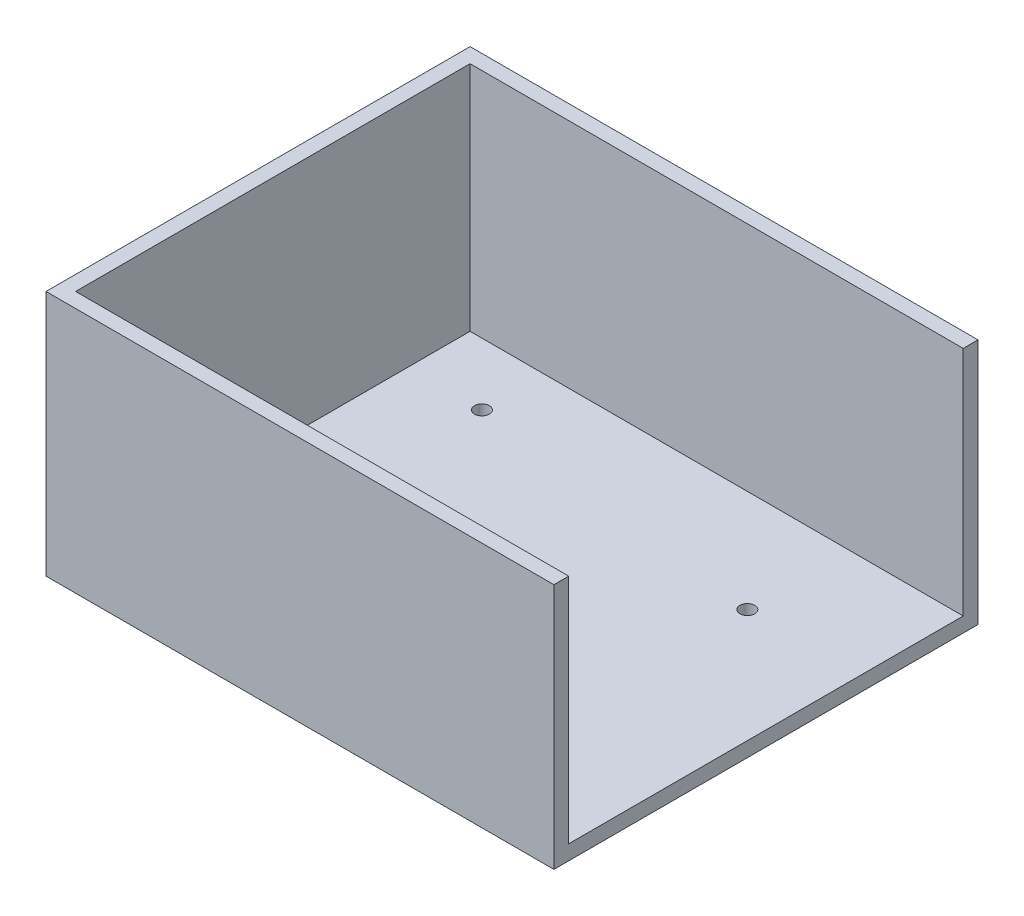
ISO-10303-21;
HEADER;
FILE_DESCRIPTION(('STEP AP214'),'2;1');
FILE_NAME('part.step','',(''),(''),'','','');
FILE_SCHEMA(('AUTOMOTIVE_DESIGN { 1 0 10303 214 1 1 1 1 }'));
ENDSEC;
DATA;
#1=APPLICATION_CONTEXT('core data for automotive mechanical design processes');
#2=APPLICATION_PROTOCOL_DEFINITION('international standard','automotive_design',2000,#1);
#3=PRODUCT_CONTEXT('',#1,'mechanical');
#4=PRODUCT('Part','Part','',(#3));
#5=PRODUCT_RELATED_PRODUCT_CATEGORY('part','',(#4));
#6=PRODUCT_DEFINITION_FORMATION('','',#4);
#7=PRODUCT_DEFINITION_CONTEXT('part definition',#1,'design');
#8=PRODUCT_DEFINITION('design','',#6,#7);
#9=PRODUCT_DEFINITION_SHAPE('','',#8);
#10=(LENGTH_UNIT() NAMED_UNIT(*) SI_UNIT(.MILLI.,.METRE.));
#11=(NAMED_UNIT(*) PLANE_ANGLE_UNIT() SI_UNIT($,.RADIAN.));
#12=(NAMED_UNIT(*) SI_UNIT($,.STERADIAN.) SOLID_ANGLE_UNIT());
#13=UNCERTAINTY_MEASURE_WITH_UNIT(LENGTH_MEASURE(1.E-05),#10,'distance_accuracy_value','');
#14=(GEOMETRIC_REPRESENTATION_CONTEXT(3) GLOBAL_UNCERTAINTY_ASSIGNED_CONTEXT((#13)) GLOBAL_UNIT_ASSIGNED_CONTEXT((#10,
#11,#12)) REPRESENTATION_CONTEXT('',''));
#15=CARTESIAN_POINT('',(0.,0.,0.));
#16=DIRECTION('',(0.,0.,1.));
#17=DIRECTION('',(1.,0.,0.));
#18=AXIS2_PLACEMENT_3D('',#15,#16,#17);
#19=CARTESIAN_POINT('',(0.,3.,0.));
#20=DIRECTION('',(0.,-1.,0.));
#21=DIRECTION('',(0.,0.,-1.));
#22=AXIS2_PLACEMENT_3D('',#19,#20,#21);
#23=PLANE('',#22);
#24=DIRECTION('',(0.,0.,1.));
#25=VECTOR('',#24,1.);
#26=CARTESIAN_POINT('',(0.,3.,0.));
#27=LINE('',#26,#25);
#28=CARTESIAN_POINT('',(0.,3.,-80.));
#29=VERTEX_POINT('',#28);
#30=CARTESIAN_POINT('',(0.,3.,0.));
#31=VERTEX_POINT('',#30);
#32=EDGE_CURVE('E49',#29,#31,#27,.T.);
#33=ORIENTED_EDGE('',*,*,#32,.T.);
#34=DIRECTION('',(1.,0.,0.));
#35=VECTOR('',#34,1.);
#36=CARTESIAN_POINT('',(0.,3.,0.));
#37=LINE('',#36,#35);
#38=CARTESIAN_POINT('',(100.,3.,0.));
#39=VERTEX_POINT('',#38);
#40=EDGE_CURVE('E185',#31,#39,#37,.T.);
#41=ORIENTED_EDGE('',*,*,#40,.T.);
#42=DIRECTION('',(0.,0.,-1.));
#43=VECTOR('',#42,1.);
#44=CARTESIAN_POINT('',(100.,3.,0.));
#45=LINE('',#44,#43);
#46=CARTESIAN_POINT('',(100.,3.,-80.));
#47=VERTEX_POINT('',#46);
#48=EDGE_CURVE('E42',#39,#47,#45,.T.);
#49=ORIENTED_EDGE('',*,*,#48,.T.);
#50=DIRECTION('',(-1.,0.,0.));
#51=VECTOR('',#50,1.);
#52=CARTESIAN_POINT('',(0.,3.,-80.));
#53=LINE('',#52,#51);
#54=EDGE_CURVE('E11',#47,#29,#53,.T.);
#55=ORIENTED_EDGE('',*,*,#54,.T.);
#56=EDGE_LOOP('',(#33,#41,#49,#55));
#57=FACE_BOUND('',#56,.T.);
#58=CARTESIAN_POINT('',(15.,3.,-67.4));
#59=DIRECTION('',(0.,1.,0.));
#60=DIRECTION('',(0.,0.,1.));
#61=AXIS2_PLACEMENT_3D('',#58,#59,#60);
#62=CIRCLE('',#61,1.5);
#63=CARTESIAN_POINT('',(15.,3.,-65.9));
#64=VERTEX_POINT('',#63);
#65=EDGE_CURVE('E179',#64,#64,#62,.T.);
#66=ORIENTED_EDGE('',*,*,#65,.F.);
#67=EDGE_LOOP('',(#66));
#68=FACE_BOUND('',#67,.T.);
#69=CARTESIAN_POINT('',(15.,3.,-12.6));
#70=DIRECTION('',(0.,1.,0.));
#71=DIRECTION('',(0.,0.,-1.));
#72=AXIS2_PLACEMENT_3D('',#69,#70,#71);
#73=CIRCLE('',#72,1.5);
#74=CARTESIAN_POINT('',(15.,3.,-14.1));
#75=VERTEX_POINT('',#74);
#76=EDGE_CURVE('E173',#75,#75,#73,.T.);
#77=ORIENTED_EDGE('',*,*,#76,.F.);
#78=EDGE_LOOP('',(#77));
#79=FACE_BOUND('',#78,.T.);
#80=CARTESIAN_POINT('',(76.9789532049797,3.,-59.25));
#81=DIRECTION('',(0.,1.,0.));
#82=DIRECTION('',(0.,0.,1.));
#83=AXIS2_PLACEMENT_3D('',#80,#81,#82);
#84=CIRCLE('',#83,1.5);
#85=CARTESIAN_POINT('',(76.9789532049797,3.,-57.75));
#86=VERTEX_POINT('',#85);
#87=EDGE_CURVE('E167',#86,#86,#84,.T.);
#88=ORIENTED_EDGE('',*,*,#87,.F.);
#89=EDGE_LOOP('',(#88));
#90=FACE_BOUND('',#89,.T.);
#91=CARTESIAN_POINT('',(76.9789532049797,3.,-20.75));
#92=DIRECTION('',(0.,1.,0.));
#93=DIRECTION('',(0.,0.,-1.));
#94=AXIS2_PLACEMENT_3D('',#91,#92,#93);
#95=CIRCLE('',#94,1.5);
#96=CARTESIAN_POINT('',(76.9789532049797,3.,-22.25));
#97=VERTEX_POINT('',#96);
#98=EDGE_CURVE('E161',#97,#97,#95,.T.);
#99=ORIENTED_EDGE('',*,*,#98,.F.);
#100=EDGE_LOOP('',(#99));
#101=FACE_BOUND('',#100,.T.);
#102=ADVANCED_FACE('F33',(#57,#68,#79,#90,#101),#23,.F.);
#103=CARTESIAN_POINT('',(0.,0.,0.));
#104=DIRECTION('',(0.,-1.,0.));
#105=DIRECTION('',(0.,0.,-1.));
#106=AXIS2_PLACEMENT_3D('',#103,#104,#105);
#107=PLANE('',#106);
#108=CARTESIAN_POINT('',(76.9789532049797,0.,-59.25));
#109=DIRECTION('',(0.,1.,0.));
#110=DIRECTION('',(0.,0.,1.));
#111=AXIS2_PLACEMENT_3D('',#108,#109,#110);
#112=CIRCLE('',#111,1.5);
#113=CARTESIAN_POINT('',(76.9789532049797,0.,-57.75));
#114=VERTEX_POINT('',#113);
#115=EDGE_CURVE('E164',#114,#114,#112,.T.);
#116=ORIENTED_EDGE('',*,*,#115,.T.);
#117=EDGE_LOOP('',(#116));
#118=FACE_BOUND('',#117,.T.);
#119=CARTESIAN_POINT('',(15.,0.,-67.4));
#120=DIRECTION('',(0.,1.,0.));
#121=DIRECTION('',(0.,0.,1.));
#122=AXIS2_PLACEMENT_3D('',#119,#120,#121);
#123=CIRCLE('',#122,1.5);
#124=CARTESIAN_POINT('',(15.,0.,-65.9));
#125=VERTEX_POINT('',#124);
#126=EDGE_CURVE('E176',#125,#125,#123,.T.);
#127=ORIENTED_EDGE('',*,*,#126,.T.);
#128=EDGE_LOOP('',(#127));
#129=FACE_BOUND('',#128,.T.);
#130=DIRECTION('',(1.,0.,0.));
#131=VECTOR('',#130,1.);
#132=CARTESIAN_POINT('',(0.,0.,3.));
#133=LINE('',#132,#131);
#134=CARTESIAN_POINT('',(-3.,0.,3.));
#135=VERTEX_POINT('',#134);
#136=CARTESIAN_POINT('',(100.,0.,3.));
#137=VERTEX_POINT('',#136);
#138=EDGE_CURVE('E117',#135,#137,#133,.T.);
#139=ORIENTED_EDGE('',*,*,#138,.F.);
#140=DIRECTION('',(0.,0.,1.));
#141=VECTOR('',#140,1.);
#142=CARTESIAN_POINT('',(-3.,0.,-83.));
#143=LINE('',#142,#141);
#144=CARTESIAN_POINT('',(-3.,0.,-83.));
#145=VERTEX_POINT('',#144);
#146=EDGE_CURVE('E113',#145,#135,#143,.T.);
#147=ORIENTED_EDGE('',*,*,#146,.F.);
#148=DIRECTION('',(1.,0.,0.));
#149=VECTOR('',#148,1.);
#150=CARTESIAN_POINT('',(0.,0.,-83.));
#151=LINE('',#150,#149);
#152=CARTESIAN_POINT('',(100.,0.,-83.));
#153=VERTEX_POINT('',#152);
#154=EDGE_CURVE('E101',#145,#153,#151,.T.);
#155=ORIENTED_EDGE('',*,*,#154,.T.);
#156=DIRECTION('',(0.,0.,-1.));
#157=VECTOR('',#156,1.);
#158=CARTESIAN_POINT('',(100.,0.,0.));
#159=LINE('',#158,#157);
#160=EDGE_CURVE('E37',#137,#153,#159,.T.);
#161=ORIENTED_EDGE('',*,*,#160,.F.);
#162=EDGE_LOOP('',(#139,#147,#155,#161));
#163=FACE_BOUND('',#162,.T.);
#164=CARTESIAN_POINT('',(15.,0.,-12.6));
#165=DIRECTION('',(0.,1.,0.));
#166=DIRECTION('',(0.,0.,-1.));
#167=AXIS2_PLACEMENT_3D('',#164,#165,#166);
#168=CIRCLE('',#167,1.5);
#169=CARTESIAN_POINT('',(15.,0.,-14.1));
#170=VERTEX_POINT('',#169);
#171=EDGE_CURVE('E170',#170,#170,#168,.T.);
#172=ORIENTED_EDGE('',*,*,#171,.T.);
#173=EDGE_LOOP('',(#172));
#174=FACE_BOUND('',#173,.T.);
#175=CARTESIAN_POINT('',(76.9789532049797,0.,-20.75));
#176=DIRECTION('',(0.,1.,0.));
#177=DIRECTION('',(0.,0.,-1.));
#178=AXIS2_PLACEMENT_3D('',#175,#176,#177);
#179=CIRCLE('',#178,1.5);
#180=CARTESIAN_POINT('',(76.9789532049797,0.,-22.25));
#181=VERTEX_POINT('',#180);
#182=EDGE_CURVE('E160',#181,#181,#179,.T.);
#183=ORIENTED_EDGE('',*,*,#182,.T.);
#184=EDGE_LOOP('',(#183));
#185=FACE_BOUND('',#184,.T.);
#186=ADVANCED_FACE('F114',(#118,#129,#163,#174,#185),#107,.T.);
#187=CARTESIAN_POINT('',(100.,3.,0.));
#188=DIRECTION('',(-1.,0.,0.));
#189=DIRECTION('',(0.,0.,1.));
#190=AXIS2_PLACEMENT_3D('',#187,#188,#189);
#191=PLANE('',#190);
#192=ORIENTED_EDGE('',*,*,#160,.T.);
#193=DIRECTION('',(0.,1.,0.));
#194=VECTOR('',#193,1.);
#195=CARTESIAN_POINT('',(100.,0.,-83.));
#196=LINE('',#195,#194);
#197=CARTESIAN_POINT('',(100.,50.,-83.));
#198=VERTEX_POINT('',#197);
#199=EDGE_CURVE('E108',#153,#198,#196,.T.);
#200=ORIENTED_EDGE('',*,*,#199,.T.);
#201=DIRECTION('',(0.,0.,1.));
#202=VECTOR('',#201,1.);
#203=CARTESIAN_POINT('',(100.,50.,-83.));
#204=LINE('',#203,#202);
#205=CARTESIAN_POINT('',(100.,50.,-80.));
#206=VERTEX_POINT('',#205);
#207=EDGE_CURVE('E110',#198,#206,#204,.T.);
#208=ORIENTED_EDGE('',*,*,#207,.T.);
#209=DIRECTION('',(0.,1.,0.));
#210=VECTOR('',#209,1.);
#211=CARTESIAN_POINT('',(100.,0.,-80.));
#212=LINE('',#211,#210);
#213=EDGE_CURVE('E137',#47,#206,#212,.T.);
#214=ORIENTED_EDGE('',*,*,#213,.F.);
#215=ORIENTED_EDGE('',*,*,#48,.F.);
#216=DIRECTION('',(0.,1.,0.));
#217=VECTOR('',#216,1.);
#218=CARTESIAN_POINT('',(100.,0.,0.));
#219=LINE('',#218,#217);
#220=CARTESIAN_POINT('',(100.,50.,0.));
#221=VERTEX_POINT('',#220);
#222=EDGE_CURVE('E57',#39,#221,#219,.T.);
#223=ORIENTED_EDGE('',*,*,#222,.T.);
#224=DIRECTION('',(0.,0.,-1.));
#225=VECTOR('',#224,1.);
#226=CARTESIAN_POINT('',(100.,50.,3.));
#227=LINE('',#226,#225);
#228=CARTESIAN_POINT('',(100.,50.,3.));
#229=VERTEX_POINT('',#228);
#230=EDGE_CURVE('E153',#229,#221,#227,.T.);
#231=ORIENTED_EDGE('',*,*,#230,.F.);
#232=DIRECTION('',(0.,1.,0.));
#233=VECTOR('',#232,1.);
#234=CARTESIAN_POINT('',(100.,0.,3.));
#235=LINE('',#234,#233);
#236=EDGE_CURVE('E148',#137,#229,#235,.T.);
#237=ORIENTED_EDGE('',*,*,#236,.F.);
#238=EDGE_LOOP('',(#192,#200,#208,#214,#215,#223,#231,#237));
#239=FACE_BOUND('',#238,.T.);
#240=ADVANCED_FACE('F35',(#239),#191,.F.);
#241=CARTESIAN_POINT('',(15.,3.,-67.4));
#242=DIRECTION('',(0.,-1.,0.));
#243=DIRECTION('',(0.,0.,-1.));
#244=AXIS2_PLACEMENT_3D('',#241,#242,#243);
#245=CYLINDRICAL_SURFACE('',#244,1.5);
#246=ORIENTED_EDGE('',*,*,#65,.T.);
#247=EDGE_LOOP('',(#246));
#248=FACE_BOUND('',#247,.T.);
#249=ORIENTED_EDGE('',*,*,#126,.F.);
#250=EDGE_LOOP('',(#249));
#251=FACE_BOUND('',#250,.T.);
#252=ADVANCED_FACE('F223',(#248,#251),#245,.F.);
#253=CARTESIAN_POINT('',(15.,3.,-12.6));
#254=DIRECTION('',(0.,-1.,0.));
#255=DIRECTION('',(0.,0.,-1.));
#256=AXIS2_PLACEMENT_3D('',#253,#254,#255);
#257=CYLINDRICAL_SURFACE('',#256,1.5);
#258=ORIENTED_EDGE('',*,*,#76,.T.);
#259=EDGE_LOOP('',(#258));
#260=FACE_BOUND('',#259,.T.);
#261=ORIENTED_EDGE('',*,*,#171,.F.);
#262=EDGE_LOOP('',(#261));
#263=FACE_BOUND('',#262,.T.);
#264=ADVANCED_FACE('F226',(#260,#263),#257,.F.);
#265=CARTESIAN_POINT('',(76.9789532049797,3.,-59.25));
#266=DIRECTION('',(0.,-1.,0.));
#267=DIRECTION('',(0.,0.,-1.));
#268=AXIS2_PLACEMENT_3D('',#265,#266,#267);
#269=CYLINDRICAL_SURFACE('',#268,1.5);
#270=ORIENTED_EDGE('',*,*,#87,.T.);
#271=EDGE_LOOP('',(#270));
#272=FACE_BOUND('',#271,.T.);
#273=ORIENTED_EDGE('',*,*,#115,.F.);
#274=EDGE_LOOP('',(#273));
#275=FACE_BOUND('',#274,.T.);
#276=ADVANCED_FACE('F212',(#272,#275),#269,.F.);
#277=CARTESIAN_POINT('',(76.9789532049797,3.,-20.75));
#278=DIRECTION('',(0.,-1.,0.));
#279=DIRECTION('',(0.,0.,-1.));
#280=AXIS2_PLACEMENT_3D('',#277,#278,#279);
#281=CYLINDRICAL_SURFACE('',#280,1.5);
#282=ORIENTED_EDGE('',*,*,#98,.T.);
#283=EDGE_LOOP('',(#282));
#284=FACE_BOUND('',#283,.T.);
#285=ORIENTED_EDGE('',*,*,#182,.F.);
#286=EDGE_LOOP('',(#285));
#287=FACE_BOUND('',#286,.T.);
#288=ADVANCED_FACE('F204',(#284,#287),#281,.F.);
#289=CARTESIAN_POINT('',(0.,0.,0.));
#290=DIRECTION('',(0.,0.,-1.));
#291=DIRECTION('',(-1.,0.,0.));
#292=AXIS2_PLACEMENT_3D('',#289,#290,#291);
#293=PLANE('',#292);
#294=ORIENTED_EDGE('',*,*,#40,.F.);
#295=DIRECTION('',(0.,-1.,0.));
#296=VECTOR('',#295,1.);
#297=CARTESIAN_POINT('',(0.,0.,0.));
#298=LINE('',#297,#296);
#299=CARTESIAN_POINT('',(0.,50.,0.));
#300=VERTEX_POINT('',#299);
#301=EDGE_CURVE('E146',#300,#31,#298,.T.);
#302=ORIENTED_EDGE('',*,*,#301,.F.);
#303=DIRECTION('',(-1.,0.,0.));
#304=VECTOR('',#303,1.);
#305=CARTESIAN_POINT('',(0.,50.,0.));
#306=LINE('',#305,#304);
#307=EDGE_CURVE('E149',#221,#300,#306,.T.);
#308=ORIENTED_EDGE('',*,*,#307,.F.);
#309=ORIENTED_EDGE('',*,*,#222,.F.);
#310=EDGE_LOOP('',(#294,#302,#308,#309));
#311=FACE_BOUND('',#310,.T.);
#312=ADVANCED_FACE('F202',(#311),#293,.T.);
#313=CARTESIAN_POINT('',(0.,50.,3.));
#314=DIRECTION('',(0.,-1.,0.));
#315=DIRECTION('',(0.,0.,-1.));
#316=AXIS2_PLACEMENT_3D('',#313,#314,#315);
#317=PLANE('',#316);
#318=ORIENTED_EDGE('',*,*,#307,.T.);
#319=DIRECTION('',(0.,0.,-1.));
#320=VECTOR('',#319,1.);
#321=CARTESIAN_POINT('',(0.,50.,-83.));
#322=LINE('',#321,#320);
#323=CARTESIAN_POINT('',(0.,50.,-80.));
#324=VERTEX_POINT('',#323);
#325=EDGE_CURVE('E127',#300,#324,#322,.T.);
#326=ORIENTED_EDGE('',*,*,#325,.T.);
#327=DIRECTION('',(-1.,0.,0.));
#328=VECTOR('',#327,1.);
#329=CARTESIAN_POINT('',(0.,50.,-80.));
#330=LINE('',#329,#328);
#331=EDGE_CURVE('E140',#206,#324,#330,.T.);
#332=ORIENTED_EDGE('',*,*,#331,.F.);
#333=ORIENTED_EDGE('',*,*,#207,.F.);
#334=DIRECTION('',(-1.,0.,0.));
#335=VECTOR('',#334,1.);
#336=CARTESIAN_POINT('',(0.,50.,-83.));
#337=LINE('',#336,#335);
#338=CARTESIAN_POINT('',(-3.,50.,-83.));
#339=VERTEX_POINT('',#338);
#340=EDGE_CURVE('E135',#198,#339,#337,.T.);
#341=ORIENTED_EDGE('',*,*,#340,.T.);
#342=DIRECTION('',(0.,0.,-1.));
#343=VECTOR('',#342,1.);
#344=CARTESIAN_POINT('',(-3.,50.,-83.));
#345=LINE('',#344,#343);
#346=CARTESIAN_POINT('',(-3.,50.,2.99999999999999));
#347=VERTEX_POINT('',#346);
#348=EDGE_CURVE('E126',#347,#339,#345,.T.);
#349=ORIENTED_EDGE('',*,*,#348,.F.);
#350=DIRECTION('',(-1.,0.,0.));
#351=VECTOR('',#350,1.);
#352=CARTESIAN_POINT('',(0.,50.,3.));
#353=LINE('',#352,#351);
#354=EDGE_CURVE('E151',#229,#347,#353,.T.);
#355=ORIENTED_EDGE('',*,*,#354,.F.);
#356=ORIENTED_EDGE('',*,*,#230,.T.);
#357=EDGE_LOOP('',(#318,#326,#332,#333,#341,#349,#355,#356));
#358=FACE_BOUND('',#357,.T.);
#359=ADVANCED_FACE('F199',(#358),#317,.F.);
#360=CARTESIAN_POINT('',(0.,0.,3.));
#361=DIRECTION('',(0.,0.,-1.));
#362=DIRECTION('',(-1.,0.,0.));
#363=AXIS2_PLACEMENT_3D('',#360,#361,#362);
#364=PLANE('',#363);
#365=ORIENTED_EDGE('',*,*,#354,.T.);
#366=DIRECTION('',(0.,1.,0.));
#367=VECTOR('',#366,1.);
#368=CARTESIAN_POINT('',(-3.,0.,3.));
#369=LINE('',#368,#367);
#370=EDGE_CURVE('E121',#135,#347,#369,.T.);
#371=ORIENTED_EDGE('',*,*,#370,.F.);
#372=ORIENTED_EDGE('',*,*,#138,.T.);
#373=ORIENTED_EDGE('',*,*,#236,.T.);
#374=EDGE_LOOP('',(#365,#371,#372,#373));
#375=FACE_BOUND('',#374,.T.);
#376=ADVANCED_FACE('F210',(#375),#364,.F.);
#377=CARTESIAN_POINT('',(0.,0.,-80.));
#378=DIRECTION('',(0.,0.,1.));
#379=DIRECTION('',(-1.,0.,0.));
#380=AXIS2_PLACEMENT_3D('',#377,#378,#379);
#381=PLANE('',#380);
#382=ORIENTED_EDGE('',*,*,#54,.F.);
#383=ORIENTED_EDGE('',*,*,#213,.T.);
#384=ORIENTED_EDGE('',*,*,#331,.T.);
#385=DIRECTION('',(0.,-1.,0.));
#386=VECTOR('',#385,1.);
#387=CARTESIAN_POINT('',(0.,0.,-80.));
#388=LINE('',#387,#386);
#389=EDGE_CURVE('E133',#324,#29,#388,.T.);
#390=ORIENTED_EDGE('',*,*,#389,.T.);
#391=EDGE_LOOP('',(#382,#383,#384,#390));
#392=FACE_BOUND('',#391,.T.);
#393=ADVANCED_FACE('F196',(#392),#381,.T.);
#394=CARTESIAN_POINT('',(0.,0.,-83.));
#395=DIRECTION('',(0.,0.,1.));
#396=DIRECTION('',(-1.,0.,0.));
#397=AXIS2_PLACEMENT_3D('',#394,#395,#396);
#398=PLANE('',#397);
#399=ORIENTED_EDGE('',*,*,#154,.F.);
#400=DIRECTION('',(0.,-1.,0.));
#401=VECTOR('',#400,1.);
#402=CARTESIAN_POINT('',(-3.,0.,-83.));
#403=LINE('',#402,#401);
#404=EDGE_CURVE('E106',#339,#145,#403,.T.);
#405=ORIENTED_EDGE('',*,*,#404,.F.);
#406=ORIENTED_EDGE('',*,*,#340,.F.);
#407=ORIENTED_EDGE('',*,*,#199,.F.);
#408=EDGE_LOOP('',(#399,#405,#406,#407));
#409=FACE_BOUND('',#408,.T.);
#410=ADVANCED_FACE('F103',(#409),#398,.F.);
#411=CARTESIAN_POINT('',(-3.,0.,0.));
#412=DIRECTION('',(1.,0.,0.));
#413=DIRECTION('',(0.,0.,-1.));
#414=AXIS2_PLACEMENT_3D('',#411,#412,#413);
#415=PLANE('',#414);
#416=ORIENTED_EDGE('',*,*,#404,.T.);
#417=ORIENTED_EDGE('',*,*,#146,.T.);
#418=ORIENTED_EDGE('',*,*,#370,.T.);
#419=ORIENTED_EDGE('',*,*,#348,.T.);
#420=EDGE_LOOP('',(#416,#417,#418,#419));
#421=FACE_BOUND('',#420,.T.);
#422=ADVANCED_FACE('F124',(#421),#415,.F.);
#423=CARTESIAN_POINT('',(0.,0.,0.));
#424=DIRECTION('',(1.,0.,0.));
#425=DIRECTION('',(0.,0.,-1.));
#426=AXIS2_PLACEMENT_3D('',#423,#424,#425);
#427=PLANE('',#426);
#428=ORIENTED_EDGE('',*,*,#325,.F.);
#429=ORIENTED_EDGE('',*,*,#301,.T.);
#430=ORIENTED_EDGE('',*,*,#32,.F.);
#431=ORIENTED_EDGE('',*,*,#389,.F.);
#432=EDGE_LOOP('',(#428,#429,#430,#431));
#433=FACE_BOUND('',#432,.T.);
#434=ADVANCED_FACE('F197',(#433),#427,.T.);
#435=CLOSED_SHELL('',(#102,#186,#240,#252,#264,#276,#288,#312,#359,#376,#393,#410,#422,#434));
#436=MANIFOLD_SOLID_BREP('B2',#435);
#437=ADVANCED_BREP_SHAPE_REPRESENTATION('',(#18,#436),#14);
#438=SHAPE_DEFINITION_REPRESENTATION(#9,#437);
ENDSEC;
END-ISO-10303-21;
